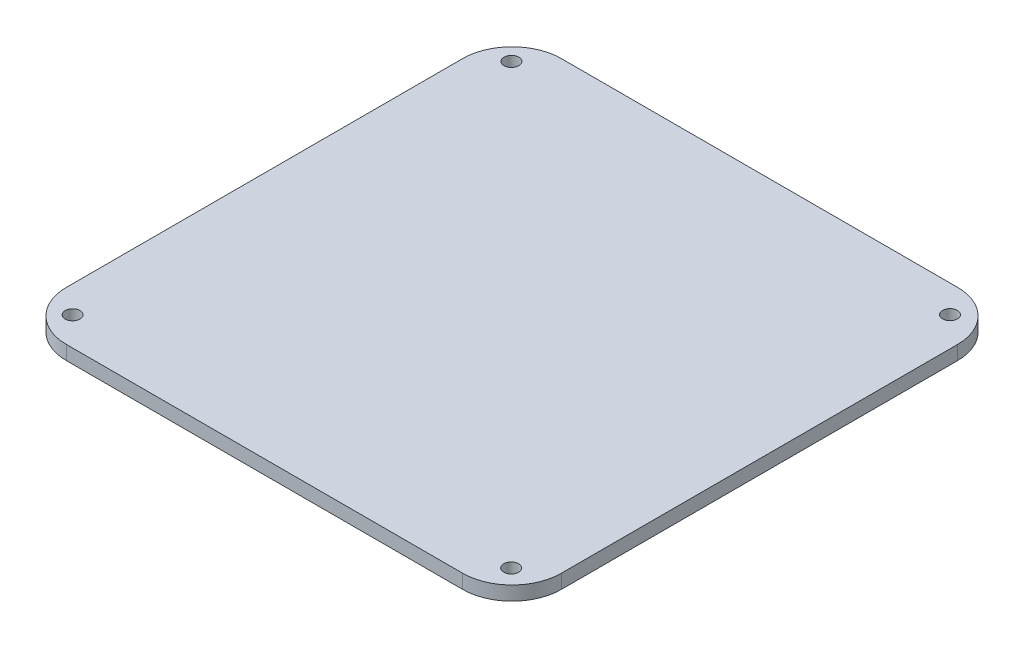
ISO-10303-21;
HEADER;
FILE_DESCRIPTION(('STEP AP214'),'2;1');
FILE_NAME('part.step','',(''),(''),'','','');
FILE_SCHEMA(('AUTOMOTIVE_DESIGN { 1 0 10303 214 1 1 1 1 }'));
ENDSEC;
DATA;
#1=APPLICATION_CONTEXT('core data for automotive mechanical design processes');
#2=APPLICATION_PROTOCOL_DEFINITION('international standard','automotive_design',2000,#1);
#3=PRODUCT_CONTEXT('',#1,'mechanical');
#4=PRODUCT('Part','Part','',(#3));
#5=PRODUCT_RELATED_PRODUCT_CATEGORY('part','',(#4));
#6=PRODUCT_DEFINITION_FORMATION('','',#4);
#7=PRODUCT_DEFINITION_CONTEXT('part definition',#1,'design');
#8=PRODUCT_DEFINITION('design','',#6,#7);
#9=PRODUCT_DEFINITION_SHAPE('','',#8);
#10=(LENGTH_UNIT() NAMED_UNIT(*) SI_UNIT(.MILLI.,.METRE.));
#11=(NAMED_UNIT(*) PLANE_ANGLE_UNIT() SI_UNIT($,.RADIAN.));
#12=(NAMED_UNIT(*) SI_UNIT($,.STERADIAN.) SOLID_ANGLE_UNIT());
#13=UNCERTAINTY_MEASURE_WITH_UNIT(LENGTH_MEASURE(1.E-05),#10,'distance_accuracy_value','');
#14=(GEOMETRIC_REPRESENTATION_CONTEXT(3) GLOBAL_UNCERTAINTY_ASSIGNED_CONTEXT((#13)) GLOBAL_UNIT_ASSIGNED_CONTEXT((#10,
#11,#12)) REPRESENTATION_CONTEXT('',''));
#15=CARTESIAN_POINT('',(0.,0.,0.));
#16=DIRECTION('',(0.,0.,1.));
#17=DIRECTION('',(1.,0.,0.));
#18=AXIS2_PLACEMENT_3D('',#15,#16,#17);
#19=CARTESIAN_POINT('',(81.3,2.56,-9.));
#20=DIRECTION('',(0.,-1.,0.));
#21=DIRECTION('',(0.,0.,-1.));
#22=AXIS2_PLACEMENT_3D('',#19,#20,#21);
#23=PLANE('',#22);
#24=CARTESIAN_POINT('',(81.3,2.56,-9.));
#25=DIRECTION('',(0.,1.,0.));
#26=DIRECTION('',(0.,0.,-1.));
#27=AXIS2_PLACEMENT_3D('',#24,#25,#26);
#28=CIRCLE('',#27,9.00000000000001);
#29=CARTESIAN_POINT('',(81.3,2.56,0.));
#30=VERTEX_POINT('',#29);
#31=CARTESIAN_POINT('',(90.3,2.56,-9.));
#32=VERTEX_POINT('',#31);
#33=EDGE_CURVE('E145',#30,#32,#28,.T.);
#34=ORIENTED_EDGE('',*,*,#33,.T.);
#35=DIRECTION('',(0.,0.,-1.));
#36=VECTOR('',#35,1.);
#37=CARTESIAN_POINT('',(90.3,2.56,-9.));
#38=LINE('',#37,#36);
#39=CARTESIAN_POINT('',(90.3,2.56,-81.3));
#40=VERTEX_POINT('',#39);
#41=EDGE_CURVE('E93',#32,#40,#38,.T.);
#42=ORIENTED_EDGE('',*,*,#41,.T.);
#43=CARTESIAN_POINT('',(81.3,2.56,-81.3));
#44=DIRECTION('',(0.,1.,0.));
#45=DIRECTION('',(0.,0.,-1.));
#46=AXIS2_PLACEMENT_3D('',#43,#44,#45);
#47=CIRCLE('',#46,8.99999999999999);
#48=CARTESIAN_POINT('',(81.3,2.56,-90.3));
#49=VERTEX_POINT('',#48);
#50=EDGE_CURVE('E160',#40,#49,#47,.T.);
#51=ORIENTED_EDGE('',*,*,#50,.T.);
#52=DIRECTION('',(-1.,0.,0.));
#53=VECTOR('',#52,1.);
#54=CARTESIAN_POINT('',(9.,2.56,-90.3));
#55=LINE('',#54,#53);
#56=CARTESIAN_POINT('',(9.,2.56,-90.3));
#57=VERTEX_POINT('',#56);
#58=EDGE_CURVE('E173',#49,#57,#55,.T.);
#59=ORIENTED_EDGE('',*,*,#58,.T.);
#60=CARTESIAN_POINT('',(9.,2.56,-81.3));
#61=DIRECTION('',(0.,1.,0.));
#62=DIRECTION('',(0.,0.,-1.));
#63=AXIS2_PLACEMENT_3D('',#60,#61,#62);
#64=CIRCLE('',#63,9.);
#65=CARTESIAN_POINT('',(0.,2.56,-81.3));
#66=VERTEX_POINT('',#65);
#67=EDGE_CURVE('E112',#57,#66,#64,.T.);
#68=ORIENTED_EDGE('',*,*,#67,.T.);
#69=DIRECTION('',(0.,0.,1.));
#70=VECTOR('',#69,1.);
#71=CARTESIAN_POINT('',(0.,2.56,-9.));
#72=LINE('',#71,#70);
#73=CARTESIAN_POINT('',(0.,2.56,-9.));
#74=VERTEX_POINT('',#73);
#75=EDGE_CURVE('E106',#66,#74,#72,.T.);
#76=ORIENTED_EDGE('',*,*,#75,.T.);
#77=CARTESIAN_POINT('',(9.,2.56,-9.));
#78=DIRECTION('',(0.,1.,0.));
#79=DIRECTION('',(0.,0.,-1.));
#80=AXIS2_PLACEMENT_3D('',#77,#78,#79);
#81=CIRCLE('',#80,9.);
#82=CARTESIAN_POINT('',(9.,2.56,0.));
#83=VERTEX_POINT('',#82);
#84=EDGE_CURVE('E110',#74,#83,#81,.T.);
#85=ORIENTED_EDGE('',*,*,#84,.T.);
#86=DIRECTION('',(1.,0.,0.));
#87=VECTOR('',#86,1.);
#88=CARTESIAN_POINT('',(9.,2.56,0.));
#89=LINE('',#88,#87);
#90=EDGE_CURVE('E50',#83,#30,#89,.T.);
#91=ORIENTED_EDGE('',*,*,#90,.T.);
#92=EDGE_LOOP('',(#34,#42,#51,#59,#68,#76,#85,#91));
#93=FACE_BOUND('',#92,.T.);
#94=CARTESIAN_POINT('',(4.9,2.56,-85.3));
#95=DIRECTION('',(0.,1.,0.));
#96=DIRECTION('',(0.,0.,1.));
#97=AXIS2_PLACEMENT_3D('',#94,#95,#96);
#98=CIRCLE('',#97,1.35);
#99=CARTESIAN_POINT('',(4.9,2.56,-86.65));
#100=VERTEX_POINT('',#99);
#101=EDGE_CURVE('E134',#100,#100,#98,.T.);
#102=ORIENTED_EDGE('',*,*,#101,.F.);
#103=EDGE_LOOP('',(#102));
#104=FACE_BOUND('',#103,.T.);
#105=CARTESIAN_POINT('',(84.9,2.56,-85.3));
#106=DIRECTION('',(0.,1.,0.));
#107=DIRECTION('',(0.,0.,1.));
#108=AXIS2_PLACEMENT_3D('',#105,#106,#107);
#109=CIRCLE('',#108,1.35000000000001);
#110=CARTESIAN_POINT('',(84.9,2.56,-86.65));
#111=VERTEX_POINT('',#110);
#112=EDGE_CURVE('E182',#111,#111,#109,.T.);
#113=ORIENTED_EDGE('',*,*,#112,.F.);
#114=EDGE_LOOP('',(#113));
#115=FACE_BOUND('',#114,.T.);
#116=CARTESIAN_POINT('',(84.9,2.56,-5.25));
#117=DIRECTION('',(0.,1.,0.));
#118=DIRECTION('',(0.,0.,1.));
#119=AXIS2_PLACEMENT_3D('',#116,#117,#118);
#120=CIRCLE('',#119,1.35000000000001);
#121=CARTESIAN_POINT('',(84.9,2.56,-6.60000000000001));
#122=VERTEX_POINT('',#121);
#123=EDGE_CURVE('E188',#122,#122,#120,.T.);
#124=ORIENTED_EDGE('',*,*,#123,.F.);
#125=EDGE_LOOP('',(#124));
#126=FACE_BOUND('',#125,.T.);
#127=CARTESIAN_POINT('',(4.9,2.56,-5.25));
#128=DIRECTION('',(0.,1.,0.));
#129=DIRECTION('',(0.,0.,1.));
#130=AXIS2_PLACEMENT_3D('',#127,#128,#129);
#131=CIRCLE('',#130,1.35);
#132=CARTESIAN_POINT('',(4.9,2.56,-6.6));
#133=VERTEX_POINT('',#132);
#134=EDGE_CURVE('E194',#133,#133,#131,.T.);
#135=ORIENTED_EDGE('',*,*,#134,.F.);
#136=EDGE_LOOP('',(#135));
#137=FACE_BOUND('',#136,.T.);
#138=ADVANCED_FACE('F33',(#93,#104,#115,#126,#137),#23,.F.);
#139=CARTESIAN_POINT('',(81.3,0.,-9.));
#140=DIRECTION('',(0.,-1.,0.));
#141=DIRECTION('',(0.,0.,-1.));
#142=AXIS2_PLACEMENT_3D('',#139,#140,#141);
#143=PLANE('',#142);
#144=CARTESIAN_POINT('',(84.9,0.,-5.25));
#145=DIRECTION('',(0.,1.,0.));
#146=DIRECTION('',(0.,0.,1.));
#147=AXIS2_PLACEMENT_3D('',#144,#145,#146);
#148=CIRCLE('',#147,1.35000000000001);
#149=CARTESIAN_POINT('',(84.9,0.,-6.60000000000001));
#150=VERTEX_POINT('',#149);
#151=EDGE_CURVE('E191',#150,#150,#148,.T.);
#152=ORIENTED_EDGE('',*,*,#151,.T.);
#153=EDGE_LOOP('',(#152));
#154=FACE_BOUND('',#153,.T.);
#155=CARTESIAN_POINT('',(4.9,0.,-85.3));
#156=DIRECTION('',(0.,1.,0.));
#157=DIRECTION('',(0.,0.,1.));
#158=AXIS2_PLACEMENT_3D('',#155,#156,#157);
#159=CIRCLE('',#158,1.35);
#160=CARTESIAN_POINT('',(4.9,0.,-86.65));
#161=VERTEX_POINT('',#160);
#162=EDGE_CURVE('E179',#161,#161,#159,.T.);
#163=ORIENTED_EDGE('',*,*,#162,.T.);
#164=EDGE_LOOP('',(#163));
#165=FACE_BOUND('',#164,.T.);
#166=CARTESIAN_POINT('',(81.3,0.,-9.));
#167=DIRECTION('',(0.,1.,0.));
#168=DIRECTION('',(0.,0.,-1.));
#169=AXIS2_PLACEMENT_3D('',#166,#167,#168);
#170=CIRCLE('',#169,9.00000000000001);
#171=CARTESIAN_POINT('',(81.3,0.,0.));
#172=VERTEX_POINT('',#171);
#173=CARTESIAN_POINT('',(90.3,0.,-9.));
#174=VERTEX_POINT('',#173);
#175=EDGE_CURVE('E130',#172,#174,#170,.T.);
#176=ORIENTED_EDGE('',*,*,#175,.F.);
#177=DIRECTION('',(1.,0.,0.));
#178=VECTOR('',#177,1.);
#179=CARTESIAN_POINT('',(9.,0.,0.));
#180=LINE('',#179,#178);
#181=CARTESIAN_POINT('',(9.,0.,0.));
#182=VERTEX_POINT('',#181);
#183=EDGE_CURVE('E85',#182,#172,#180,.T.);
#184=ORIENTED_EDGE('',*,*,#183,.F.);
#185=CARTESIAN_POINT('',(9.,0.,-9.));
#186=DIRECTION('',(0.,1.,0.));
#187=DIRECTION('',(0.,0.,-1.));
#188=AXIS2_PLACEMENT_3D('',#185,#186,#187);
#189=CIRCLE('',#188,9.);
#190=CARTESIAN_POINT('',(0.,0.,-9.));
#191=VERTEX_POINT('',#190);
#192=EDGE_CURVE('E79',#191,#182,#189,.T.);
#193=ORIENTED_EDGE('',*,*,#192,.F.);
#194=DIRECTION('',(0.,0.,1.));
#195=VECTOR('',#194,1.);
#196=CARTESIAN_POINT('',(0.,0.,-9.));
#197=LINE('',#196,#195);
#198=CARTESIAN_POINT('',(0.,0.,-81.3));
#199=VERTEX_POINT('',#198);
#200=EDGE_CURVE('E120',#199,#191,#197,.T.);
#201=ORIENTED_EDGE('',*,*,#200,.F.);
#202=CARTESIAN_POINT('',(9.,0.,-81.3));
#203=DIRECTION('',(0.,1.,0.));
#204=DIRECTION('',(0.,0.,-1.));
#205=AXIS2_PLACEMENT_3D('',#202,#203,#204);
#206=CIRCLE('',#205,9.);
#207=CARTESIAN_POINT('',(9.,0.,-90.3));
#208=VERTEX_POINT('',#207);
#209=EDGE_CURVE('E140',#208,#199,#206,.T.);
#210=ORIENTED_EDGE('',*,*,#209,.F.);
#211=DIRECTION('',(-1.,0.,0.));
#212=VECTOR('',#211,1.);
#213=CARTESIAN_POINT('',(9.,0.,-90.3));
#214=LINE('',#213,#212);
#215=CARTESIAN_POINT('',(81.3,0.,-90.3));
#216=VERTEX_POINT('',#215);
#217=EDGE_CURVE('E138',#216,#208,#214,.T.);
#218=ORIENTED_EDGE('',*,*,#217,.F.);
#219=CARTESIAN_POINT('',(81.3,0.,-81.3));
#220=DIRECTION('',(0.,1.,0.));
#221=DIRECTION('',(0.,0.,-1.));
#222=AXIS2_PLACEMENT_3D('',#219,#220,#221);
#223=CIRCLE('',#222,8.99999999999999);
#224=CARTESIAN_POINT('',(90.3,0.,-81.3));
#225=VERTEX_POINT('',#224);
#226=EDGE_CURVE('E136',#225,#216,#223,.T.);
#227=ORIENTED_EDGE('',*,*,#226,.F.);
#228=DIRECTION('',(0.,0.,-1.));
#229=VECTOR('',#228,1.);
#230=CARTESIAN_POINT('',(90.3,0.,-9.));
#231=LINE('',#230,#229);
#232=EDGE_CURVE('E133',#174,#225,#231,.T.);
#233=ORIENTED_EDGE('',*,*,#232,.F.);
#234=EDGE_LOOP('',(#176,#184,#193,#201,#210,#218,#227,#233));
#235=FACE_BOUND('',#234,.T.);
#236=CARTESIAN_POINT('',(84.9,0.,-85.3));
#237=DIRECTION('',(0.,1.,0.));
#238=DIRECTION('',(0.,0.,1.));
#239=AXIS2_PLACEMENT_3D('',#236,#237,#238);
#240=CIRCLE('',#239,1.35000000000001);
#241=CARTESIAN_POINT('',(84.9,0.,-86.65));
#242=VERTEX_POINT('',#241);
#243=EDGE_CURVE('E185',#242,#242,#240,.T.);
#244=ORIENTED_EDGE('',*,*,#243,.T.);
#245=EDGE_LOOP('',(#244));
#246=FACE_BOUND('',#245,.T.);
#247=CARTESIAN_POINT('',(4.9,0.,-5.25));
#248=DIRECTION('',(0.,1.,0.));
#249=DIRECTION('',(0.,0.,1.));
#250=AXIS2_PLACEMENT_3D('',#247,#248,#249);
#251=CIRCLE('',#250,1.35);
#252=CARTESIAN_POINT('',(4.9,0.,-6.6));
#253=VERTEX_POINT('',#252);
#254=EDGE_CURVE('E197',#253,#253,#251,.T.);
#255=ORIENTED_EDGE('',*,*,#254,.T.);
#256=EDGE_LOOP('',(#255));
#257=FACE_BOUND('',#256,.T.);
#258=ADVANCED_FACE('F164',(#154,#165,#235,#246,#257),#143,.T.);
#259=CARTESIAN_POINT('',(81.3,2.56,-9.));
#260=DIRECTION('',(0.,-1.,0.));
#261=DIRECTION('',(0.,0.,-1.));
#262=AXIS2_PLACEMENT_3D('',#259,#260,#261);
#263=CYLINDRICAL_SURFACE('',#262,9.00000000000001);
#264=ORIENTED_EDGE('',*,*,#175,.T.);
#265=DIRECTION('',(0.,-1.,0.));
#266=VECTOR('',#265,1.);
#267=CARTESIAN_POINT('',(90.3,2.56,-9.));
#268=LINE('',#267,#266);
#269=EDGE_CURVE('E11',#32,#174,#268,.T.);
#270=ORIENTED_EDGE('',*,*,#269,.F.);
#271=ORIENTED_EDGE('',*,*,#33,.F.);
#272=DIRECTION('',(0.,-1.,0.));
#273=VECTOR('',#272,1.);
#274=CARTESIAN_POINT('',(81.3,2.56,0.));
#275=LINE('',#274,#273);
#276=EDGE_CURVE('E126',#30,#172,#275,.T.);
#277=ORIENTED_EDGE('',*,*,#276,.T.);
#278=EDGE_LOOP('',(#264,#270,#271,#277));
#279=FACE_BOUND('',#278,.T.);
#280=ADVANCED_FACE('F35',(#279),#263,.T.);
#281=CARTESIAN_POINT('',(90.3,2.56,-9.));
#282=DIRECTION('',(-1.,0.,0.));
#283=DIRECTION('',(0.,0.,1.));
#284=AXIS2_PLACEMENT_3D('',#281,#282,#283);
#285=PLANE('',#284);
#286=ORIENTED_EDGE('',*,*,#232,.T.);
#287=DIRECTION('',(0.,-1.,0.));
#288=VECTOR('',#287,1.);
#289=CARTESIAN_POINT('',(90.3,2.56,-81.3));
#290=LINE('',#289,#288);
#291=EDGE_CURVE('E42',#40,#225,#290,.T.);
#292=ORIENTED_EDGE('',*,*,#291,.F.);
#293=ORIENTED_EDGE('',*,*,#41,.F.);
#294=ORIENTED_EDGE('',*,*,#269,.T.);
#295=EDGE_LOOP('',(#286,#292,#293,#294));
#296=FACE_BOUND('',#295,.T.);
#297=ADVANCED_FACE('F229',(#296),#285,.F.);
#298=CARTESIAN_POINT('',(81.3,2.56,-81.3));
#299=DIRECTION('',(0.,-1.,0.));
#300=DIRECTION('',(0.,0.,-1.));
#301=AXIS2_PLACEMENT_3D('',#298,#299,#300);
#302=CYLINDRICAL_SURFACE('',#301,8.99999999999999);
#303=ORIENTED_EDGE('',*,*,#226,.T.);
#304=DIRECTION('',(0.,-1.,0.));
#305=VECTOR('',#304,1.);
#306=CARTESIAN_POINT('',(81.3,2.56,-90.3));
#307=LINE('',#306,#305);
#308=EDGE_CURVE('E152',#49,#216,#307,.T.);
#309=ORIENTED_EDGE('',*,*,#308,.F.);
#310=ORIENTED_EDGE('',*,*,#50,.F.);
#311=ORIENTED_EDGE('',*,*,#291,.T.);
#312=EDGE_LOOP('',(#303,#309,#310,#311));
#313=FACE_BOUND('',#312,.T.);
#314=ADVANCED_FACE('F158',(#313),#302,.T.);
#315=CARTESIAN_POINT('',(9.,2.56,-90.3));
#316=DIRECTION('',(0.,0.,1.));
#317=DIRECTION('',(1.,0.,0.));
#318=AXIS2_PLACEMENT_3D('',#315,#316,#317);
#319=PLANE('',#318);
#320=ORIENTED_EDGE('',*,*,#217,.T.);
#321=DIRECTION('',(0.,-1.,0.));
#322=VECTOR('',#321,1.);
#323=CARTESIAN_POINT('',(9.,2.56,-90.3));
#324=LINE('',#323,#322);
#325=EDGE_CURVE('E149',#57,#208,#324,.T.);
#326=ORIENTED_EDGE('',*,*,#325,.F.);
#327=ORIENTED_EDGE('',*,*,#58,.F.);
#328=ORIENTED_EDGE('',*,*,#308,.T.);
#329=EDGE_LOOP('',(#320,#326,#327,#328));
#330=FACE_BOUND('',#329,.T.);
#331=ADVANCED_FACE('F169',(#330),#319,.F.);
#332=CARTESIAN_POINT('',(9.,2.56,-81.3));
#333=DIRECTION('',(0.,-1.,0.));
#334=DIRECTION('',(0.,0.,-1.));
#335=AXIS2_PLACEMENT_3D('',#332,#333,#334);
#336=CYLINDRICAL_SURFACE('',#335,9.);
#337=ORIENTED_EDGE('',*,*,#209,.T.);
#338=DIRECTION('',(0.,-1.,0.));
#339=VECTOR('',#338,1.);
#340=CARTESIAN_POINT('',(0.,2.56,-81.3));
#341=LINE('',#340,#339);
#342=EDGE_CURVE('E121',#66,#199,#341,.T.);
#343=ORIENTED_EDGE('',*,*,#342,.F.);
#344=ORIENTED_EDGE('',*,*,#67,.F.);
#345=ORIENTED_EDGE('',*,*,#325,.T.);
#346=EDGE_LOOP('',(#337,#343,#344,#345));
#347=FACE_BOUND('',#346,.T.);
#348=ADVANCED_FACE('F172',(#347),#336,.T.);
#349=CARTESIAN_POINT('',(0.,2.56,-9.));
#350=DIRECTION('',(1.,0.,0.));
#351=DIRECTION('',(0.,0.,-1.));
#352=AXIS2_PLACEMENT_3D('',#349,#350,#351);
#353=PLANE('',#352);
#354=ORIENTED_EDGE('',*,*,#200,.T.);
#355=DIRECTION('',(0.,-1.,0.));
#356=VECTOR('',#355,1.);
#357=CARTESIAN_POINT('',(0.,2.56,-9.));
#358=LINE('',#357,#356);
#359=EDGE_CURVE('E117',#74,#191,#358,.T.);
#360=ORIENTED_EDGE('',*,*,#359,.F.);
#361=ORIENTED_EDGE('',*,*,#75,.F.);
#362=ORIENTED_EDGE('',*,*,#342,.T.);
#363=EDGE_LOOP('',(#354,#360,#361,#362));
#364=FACE_BOUND('',#363,.T.);
#365=ADVANCED_FACE('F118',(#364),#353,.F.);
#366=CARTESIAN_POINT('',(9.,2.56,-9.));
#367=DIRECTION('',(0.,-1.,0.));
#368=DIRECTION('',(0.,0.,-1.));
#369=AXIS2_PLACEMENT_3D('',#366,#367,#368);
#370=CYLINDRICAL_SURFACE('',#369,9.);
#371=ORIENTED_EDGE('',*,*,#192,.T.);
#372=DIRECTION('',(0.,-1.,0.));
#373=VECTOR('',#372,1.);
#374=CARTESIAN_POINT('',(9.,2.56,0.));
#375=LINE('',#374,#373);
#376=EDGE_CURVE('E122',#83,#182,#375,.T.);
#377=ORIENTED_EDGE('',*,*,#376,.F.);
#378=ORIENTED_EDGE('',*,*,#84,.F.);
#379=ORIENTED_EDGE('',*,*,#359,.T.);
#380=EDGE_LOOP('',(#371,#377,#378,#379));
#381=FACE_BOUND('',#380,.T.);
#382=ADVANCED_FACE('F124',(#381),#370,.T.);
#383=CARTESIAN_POINT('',(9.,2.56,0.));
#384=DIRECTION('',(0.,0.,-1.));
#385=DIRECTION('',(-1.,0.,0.));
#386=AXIS2_PLACEMENT_3D('',#383,#384,#385);
#387=PLANE('',#386);
#388=ORIENTED_EDGE('',*,*,#183,.T.);
#389=ORIENTED_EDGE('',*,*,#276,.F.);
#390=ORIENTED_EDGE('',*,*,#90,.F.);
#391=ORIENTED_EDGE('',*,*,#376,.T.);
#392=EDGE_LOOP('',(#388,#389,#390,#391));
#393=FACE_BOUND('',#392,.T.);
#394=ADVANCED_FACE('F217',(#393),#387,.F.);
#395=CARTESIAN_POINT('',(4.9,2.56,-85.3));
#396=DIRECTION('',(0.,-1.,0.));
#397=DIRECTION('',(0.,0.,-1.));
#398=AXIS2_PLACEMENT_3D('',#395,#396,#397);
#399=CYLINDRICAL_SURFACE('',#398,1.35);
#400=CARTESIAN_POINT('',(4.9,2.56,-86.65));
#401=CARTESIAN_POINT('',(4.9,2.53333333333333,-86.65));
#402=CARTESIAN_POINT('',(4.9,2.50666666666667,-86.65));
#403=CARTESIAN_POINT('',(4.9,2.45333333333333,-86.65));
#404=CARTESIAN_POINT('',(4.9,2.42666666666667,-86.65));
#405=CARTESIAN_POINT('',(4.9,2.37333333333333,-86.65));
#406=CARTESIAN_POINT('',(4.9,2.34666666666667,-86.65));
#407=CARTESIAN_POINT('',(4.9,2.29333333333333,-86.65));
#408=CARTESIAN_POINT('',(4.9,2.26666666666667,-86.65));
#409=CARTESIAN_POINT('',(4.9,2.21333333333333,-86.65));
#410=CARTESIAN_POINT('',(4.9,2.18666666666667,-86.65));
#411=CARTESIAN_POINT('',(4.9,2.13333333333333,-86.65));
#412=CARTESIAN_POINT('',(4.9,2.10666666666667,-86.65));
#413=CARTESIAN_POINT('',(4.9,2.05333333333333,-86.65));
#414=CARTESIAN_POINT('',(4.9,2.02666666666667,-86.65));
#415=CARTESIAN_POINT('',(4.9,1.97333333333333,-86.65));
#416=CARTESIAN_POINT('',(4.9,1.94666666666667,-86.65));
#417=CARTESIAN_POINT('',(4.9,1.89333333333333,-86.65));
#418=CARTESIAN_POINT('',(4.9,1.86666666666667,-86.65));
#419=CARTESIAN_POINT('',(4.9,1.81333333333333,-86.65));
#420=CARTESIAN_POINT('',(4.9,1.78666666666667,-86.65));
#421=CARTESIAN_POINT('',(4.9,1.73333333333333,-86.65));
#422=CARTESIAN_POINT('',(4.9,1.70666666666667,-86.65));
#423=CARTESIAN_POINT('',(4.9,1.65333333333333,-86.65));
#424=CARTESIAN_POINT('',(4.9,1.62666666666667,-86.65));
#425=CARTESIAN_POINT('',(4.9,1.57333333333333,-86.65));
#426=CARTESIAN_POINT('',(4.9,1.54666666666667,-86.65));
#427=CARTESIAN_POINT('',(4.9,1.49333333333333,-86.65));
#428=CARTESIAN_POINT('',(4.9,1.46666666666667,-86.65));
#429=CARTESIAN_POINT('',(4.9,1.41333333333333,-86.65));
#430=CARTESIAN_POINT('',(4.9,1.38666666666667,-86.65));
#431=CARTESIAN_POINT('',(4.9,1.33333333333333,-86.65));
#432=CARTESIAN_POINT('',(4.9,1.30666666666667,-86.65));
#433=CARTESIAN_POINT('',(4.9,1.25333333333333,-86.65));
#434=CARTESIAN_POINT('',(4.9,1.22666666666667,-86.65));
#435=CARTESIAN_POINT('',(4.9,1.17333333333333,-86.65));
#436=CARTESIAN_POINT('',(4.9,1.14666666666667,-86.65));
#437=CARTESIAN_POINT('',(4.9,1.09333333333333,-86.65));
#438=CARTESIAN_POINT('',(4.9,1.06666666666667,-86.65));
#439=CARTESIAN_POINT('',(4.9,1.01333333333333,-86.65));
#440=CARTESIAN_POINT('',(4.9,0.986666666666666,-86.65));
#441=CARTESIAN_POINT('',(4.9,0.933333333333333,-86.65));
#442=CARTESIAN_POINT('',(4.9,0.906666666666666,-86.65));
#443=CARTESIAN_POINT('',(4.9,0.853333333333333,-86.65));
#444=CARTESIAN_POINT('',(4.9,0.826666666666666,-86.65));
#445=CARTESIAN_POINT('',(4.9,0.773333333333333,-86.65));
#446=CARTESIAN_POINT('',(4.9,0.746666666666666,-86.65));
#447=CARTESIAN_POINT('',(4.9,0.693333333333333,-86.65));
#448=CARTESIAN_POINT('',(4.9,0.666666666666666,-86.65));
#449=CARTESIAN_POINT('',(4.9,0.613333333333333,-86.65));
#450=CARTESIAN_POINT('',(4.9,0.586666666666667,-86.65));
#451=CARTESIAN_POINT('',(4.9,0.533333333333333,-86.65));
#452=CARTESIAN_POINT('',(4.9,0.506666666666667,-86.65));
#453=CARTESIAN_POINT('',(4.9,0.453333333333333,-86.65));
#454=CARTESIAN_POINT('',(4.9,0.426666666666667,-86.65));
#455=CARTESIAN_POINT('',(4.9,0.373333333333333,-86.65));
#456=CARTESIAN_POINT('',(4.9,0.346666666666667,-86.65));
#457=CARTESIAN_POINT('',(4.9,0.293333333333333,-86.65));
#458=CARTESIAN_POINT('',(4.9,0.266666666666667,-86.65));
#459=CARTESIAN_POINT('',(4.9,0.213333333333333,-86.65));
#460=CARTESIAN_POINT('',(4.9,0.186666666666667,-86.65));
#461=CARTESIAN_POINT('',(4.9,0.133333333333333,-86.65));
#462=CARTESIAN_POINT('',(4.9,0.106666666666667,-86.65));
#463=CARTESIAN_POINT('',(4.9,0.0533333333333335,-86.65));
#464=CARTESIAN_POINT('',(4.9,0.0266666666666667,-86.65));
#465=CARTESIAN_POINT('',(4.9,0.,-86.65));
#466=B_SPLINE_CURVE_WITH_KNOTS('',3,(#400,#401,#402,#403,#404,#405,#406,#407,#408,#409,#410,
#411,#412,#413,#414,#415,#416,#417,#418,#419,#420,#421,#422,#423,#424,#425,#426,#427,#428,#429,
#430,#431,#432,#433,#434,#435,#436,#437,#438,#439,#440,#441,#442,#443,#444,#445,#446,#447,#448,
#449,#450,#451,#452,#453,#454,#455,#456,#457,#458,#459,#460,#461,#462,#463,#464,#465),
.UNSPECIFIED.,.F.,.F.,(4,2,2,2,2,2,2,2,2,2,2,2,2,2,2,2,2,2,2,2,2,2,2,2,2,2,2,2,2,2,2,2,4),(0.,
0.0800000000000002,0.16,0.24,0.32,0.4,0.48,0.56,0.64,0.72,0.8,0.88,0.96,1.04,1.12,1.2,1.28,1.36,
1.44,1.52,1.6,1.68,1.76,1.84,1.92,2.,2.08,2.16,2.24,2.32,2.4,2.48,2.56),.UNSPECIFIED.);
#467=EDGE_CURVE('BSEAM214',#100,#161,#466,.T.);
#468=ORIENTED_EDGE('',*,*,#101,.T.);
#469=ORIENTED_EDGE('',*,*,#162,.F.);
#470=ORIENTED_EDGE('',*,*,#467,.T.);
#471=ORIENTED_EDGE('',*,*,#467,.F.);
#472=EDGE_LOOP('',(#468,#470,#469,#471));
#473=FACE_BOUND('',#472,.T.);
#474=ADVANCED_FACE('F214',(#473),#399,.F.);
#475=CARTESIAN_POINT('',(84.9,2.56,-85.3));
#476=DIRECTION('',(0.,-1.,0.));
#477=DIRECTION('',(0.,0.,-1.));
#478=AXIS2_PLACEMENT_3D('',#475,#476,#477);
#479=CYLINDRICAL_SURFACE('',#478,1.35000000000001);
#480=CARTESIAN_POINT('',(84.9,2.56,-86.65));
#481=CARTESIAN_POINT('',(84.9,2.53333333333333,-86.65));
#482=CARTESIAN_POINT('',(84.9,2.50666666666667,-86.65));
#483=CARTESIAN_POINT('',(84.9,2.45333333333333,-86.65));
#484=CARTESIAN_POINT('',(84.9,2.42666666666667,-86.65));
#485=CARTESIAN_POINT('',(84.9,2.37333333333333,-86.65));
#486=CARTESIAN_POINT('',(84.9,2.34666666666667,-86.65));
#487=CARTESIAN_POINT('',(84.9,2.29333333333333,-86.65));
#488=CARTESIAN_POINT('',(84.9,2.26666666666667,-86.65));
#489=CARTESIAN_POINT('',(84.9,2.21333333333333,-86.65));
#490=CARTESIAN_POINT('',(84.9,2.18666666666667,-86.65));
#491=CARTESIAN_POINT('',(84.9,2.13333333333333,-86.65));
#492=CARTESIAN_POINT('',(84.9,2.10666666666667,-86.65));
#493=CARTESIAN_POINT('',(84.9,2.05333333333333,-86.65));
#494=CARTESIAN_POINT('',(84.9,2.02666666666667,-86.65));
#495=CARTESIAN_POINT('',(84.9,1.97333333333333,-86.65));
#496=CARTESIAN_POINT('',(84.9,1.94666666666667,-86.65));
#497=CARTESIAN_POINT('',(84.9,1.89333333333333,-86.65));
#498=CARTESIAN_POINT('',(84.9,1.86666666666667,-86.65));
#499=CARTESIAN_POINT('',(84.9,1.81333333333333,-86.65));
#500=CARTESIAN_POINT('',(84.9,1.78666666666667,-86.65));
#501=CARTESIAN_POINT('',(84.9,1.73333333333333,-86.65));
#502=CARTESIAN_POINT('',(84.9,1.70666666666667,-86.65));
#503=CARTESIAN_POINT('',(84.9,1.65333333333333,-86.65));
#504=CARTESIAN_POINT('',(84.9,1.62666666666667,-86.65));
#505=CARTESIAN_POINT('',(84.9,1.57333333333333,-86.65));
#506=CARTESIAN_POINT('',(84.9,1.54666666666667,-86.65));
#507=CARTESIAN_POINT('',(84.9,1.49333333333333,-86.65));
#508=CARTESIAN_POINT('',(84.9,1.46666666666667,-86.65));
#509=CARTESIAN_POINT('',(84.9,1.41333333333333,-86.65));
#510=CARTESIAN_POINT('',(84.9,1.38666666666667,-86.65));
#511=CARTESIAN_POINT('',(84.9,1.33333333333333,-86.65));
#512=CARTESIAN_POINT('',(84.9,1.30666666666667,-86.65));
#513=CARTESIAN_POINT('',(84.9,1.25333333333333,-86.65));
#514=CARTESIAN_POINT('',(84.9,1.22666666666667,-86.65));
#515=CARTESIAN_POINT('',(84.9,1.17333333333333,-86.65));
#516=CARTESIAN_POINT('',(84.9,1.14666666666667,-86.65));
#517=CARTESIAN_POINT('',(84.9,1.09333333333333,-86.65));
#518=CARTESIAN_POINT('',(84.9,1.06666666666667,-86.65));
#519=CARTESIAN_POINT('',(84.9,1.01333333333333,-86.65));
#520=CARTESIAN_POINT('',(84.9,0.986666666666666,-86.65));
#521=CARTESIAN_POINT('',(84.9,0.933333333333333,-86.65));
#522=CARTESIAN_POINT('',(84.9,0.906666666666666,-86.65));
#523=CARTESIAN_POINT('',(84.9,0.853333333333333,-86.65));
#524=CARTESIAN_POINT('',(84.9,0.826666666666666,-86.65));
#525=CARTESIAN_POINT('',(84.9,0.773333333333333,-86.65));
#526=CARTESIAN_POINT('',(84.9,0.746666666666666,-86.65));
#527=CARTESIAN_POINT('',(84.9,0.693333333333333,-86.65));
#528=CARTESIAN_POINT('',(84.9,0.666666666666666,-86.65));
#529=CARTESIAN_POINT('',(84.9,0.613333333333333,-86.65));
#530=CARTESIAN_POINT('',(84.9,0.586666666666667,-86.65));
#531=CARTESIAN_POINT('',(84.9,0.533333333333333,-86.65));
#532=CARTESIAN_POINT('',(84.9,0.506666666666667,-86.65));
#533=CARTESIAN_POINT('',(84.9,0.453333333333333,-86.65));
#534=CARTESIAN_POINT('',(84.9,0.426666666666667,-86.65));
#535=CARTESIAN_POINT('',(84.9,0.373333333333333,-86.65));
#536=CARTESIAN_POINT('',(84.9,0.346666666666667,-86.65));
#537=CARTESIAN_POINT('',(84.9,0.293333333333333,-86.65));
#538=CARTESIAN_POINT('',(84.9,0.266666666666667,-86.65));
#539=CARTESIAN_POINT('',(84.9,0.213333333333333,-86.65));
#540=CARTESIAN_POINT('',(84.9,0.186666666666667,-86.65));
#541=CARTESIAN_POINT('',(84.9,0.133333333333333,-86.65));
#542=CARTESIAN_POINT('',(84.9,0.106666666666667,-86.65));
#543=CARTESIAN_POINT('',(84.9,0.0533333333333335,-86.65));
#544=CARTESIAN_POINT('',(84.9,0.0266666666666667,-86.65));
#545=CARTESIAN_POINT('',(84.9,0.,-86.65));
#546=B_SPLINE_CURVE_WITH_KNOTS('',3,(#480,#481,#482,#483,#484,#485,#486,#487,#488,#489,#490,
#491,#492,#493,#494,#495,#496,#497,#498,#499,#500,#501,#502,#503,#504,#505,#506,#507,#508,#509,
#510,#511,#512,#513,#514,#515,#516,#517,#518,#519,#520,#521,#522,#523,#524,#525,#526,#527,#528,
#529,#530,#531,#532,#533,#534,#535,#536,#537,#538,#539,#540,#541,#542,#543,#544,#545),
.UNSPECIFIED.,.F.,.F.,(4,2,2,2,2,2,2,2,2,2,2,2,2,2,2,2,2,2,2,2,2,2,2,2,2,2,2,2,2,2,2,2,4),(0.,
0.0800000000000002,0.16,0.24,0.32,0.4,0.48,0.56,0.64,0.72,0.8,0.88,0.96,1.04,1.12,1.2,1.28,1.36,
1.44,1.52,1.6,1.68,1.76,1.84,1.92,2.,2.08,2.16,2.24,2.32,2.4,2.48,2.56),.UNSPECIFIED.);
#547=EDGE_CURVE('BSEAM293',#111,#242,#546,.T.);
#548=ORIENTED_EDGE('',*,*,#112,.T.);
#549=ORIENTED_EDGE('',*,*,#243,.F.);
#550=ORIENTED_EDGE('',*,*,#547,.T.);
#551=ORIENTED_EDGE('',*,*,#547,.F.);
#552=EDGE_LOOP('',(#548,#550,#549,#551));
#553=FACE_BOUND('',#552,.T.);
#554=ADVANCED_FACE('F293',(#553),#479,.F.);
#555=CARTESIAN_POINT('',(84.9,2.56,-5.25));
#556=DIRECTION('',(0.,-1.,0.));
#557=DIRECTION('',(0.,0.,-1.));
#558=AXIS2_PLACEMENT_3D('',#555,#556,#557);
#559=CYLINDRICAL_SURFACE('',#558,1.35000000000001);
#560=CARTESIAN_POINT('',(84.9,2.56,-6.60000000000001));
#561=CARTESIAN_POINT('',(84.9,2.53333333333333,-6.60000000000001));
#562=CARTESIAN_POINT('',(84.9,2.50666666666667,-6.60000000000001));
#563=CARTESIAN_POINT('',(84.9,2.45333333333333,-6.60000000000001));
#564=CARTESIAN_POINT('',(84.9,2.42666666666667,-6.60000000000001));
#565=CARTESIAN_POINT('',(84.9,2.37333333333333,-6.60000000000001));
#566=CARTESIAN_POINT('',(84.9,2.34666666666667,-6.60000000000001));
#567=CARTESIAN_POINT('',(84.9,2.29333333333333,-6.60000000000001));
#568=CARTESIAN_POINT('',(84.9,2.26666666666667,-6.60000000000001));
#569=CARTESIAN_POINT('',(84.9,2.21333333333333,-6.60000000000001));
#570=CARTESIAN_POINT('',(84.9,2.18666666666667,-6.60000000000001));
#571=CARTESIAN_POINT('',(84.9,2.13333333333333,-6.60000000000001));
#572=CARTESIAN_POINT('',(84.9,2.10666666666667,-6.60000000000001));
#573=CARTESIAN_POINT('',(84.9,2.05333333333333,-6.60000000000001));
#574=CARTESIAN_POINT('',(84.9,2.02666666666667,-6.60000000000001));
#575=CARTESIAN_POINT('',(84.9,1.97333333333333,-6.60000000000001));
#576=CARTESIAN_POINT('',(84.9,1.94666666666667,-6.60000000000001));
#577=CARTESIAN_POINT('',(84.9,1.89333333333333,-6.60000000000001));
#578=CARTESIAN_POINT('',(84.9,1.86666666666667,-6.60000000000001));
#579=CARTESIAN_POINT('',(84.9,1.81333333333333,-6.60000000000001));
#580=CARTESIAN_POINT('',(84.9,1.78666666666667,-6.60000000000001));
#581=CARTESIAN_POINT('',(84.9,1.73333333333333,-6.60000000000001));
#582=CARTESIAN_POINT('',(84.9,1.70666666666667,-6.60000000000001));
#583=CARTESIAN_POINT('',(84.9,1.65333333333333,-6.60000000000001));
#584=CARTESIAN_POINT('',(84.9,1.62666666666667,-6.60000000000001));
#585=CARTESIAN_POINT('',(84.9,1.57333333333333,-6.60000000000001));
#586=CARTESIAN_POINT('',(84.9,1.54666666666667,-6.60000000000001));
#587=CARTESIAN_POINT('',(84.9,1.49333333333333,-6.60000000000001));
#588=CARTESIAN_POINT('',(84.9,1.46666666666667,-6.60000000000001));
#589=CARTESIAN_POINT('',(84.9,1.41333333333333,-6.60000000000001));
#590=CARTESIAN_POINT('',(84.9,1.38666666666667,-6.60000000000001));
#591=CARTESIAN_POINT('',(84.9,1.33333333333333,-6.60000000000001));
#592=CARTESIAN_POINT('',(84.9,1.30666666666667,-6.60000000000001));
#593=CARTESIAN_POINT('',(84.9,1.25333333333333,-6.60000000000001));
#594=CARTESIAN_POINT('',(84.9,1.22666666666667,-6.60000000000001));
#595=CARTESIAN_POINT('',(84.9,1.17333333333333,-6.60000000000001));
#596=CARTESIAN_POINT('',(84.9,1.14666666666667,-6.60000000000001));
#597=CARTESIAN_POINT('',(84.9,1.09333333333333,-6.60000000000001));
#598=CARTESIAN_POINT('',(84.9,1.06666666666667,-6.60000000000001));
#599=CARTESIAN_POINT('',(84.9,1.01333333333333,-6.60000000000001));
#600=CARTESIAN_POINT('',(84.9,0.986666666666666,-6.60000000000001));
#601=CARTESIAN_POINT('',(84.9,0.933333333333333,-6.60000000000001));
#602=CARTESIAN_POINT('',(84.9,0.906666666666666,-6.60000000000001));
#603=CARTESIAN_POINT('',(84.9,0.853333333333333,-6.60000000000001));
#604=CARTESIAN_POINT('',(84.9,0.826666666666666,-6.60000000000001));
#605=CARTESIAN_POINT('',(84.9,0.773333333333333,-6.60000000000001));
#606=CARTESIAN_POINT('',(84.9,0.746666666666666,-6.60000000000001));
#607=CARTESIAN_POINT('',(84.9,0.693333333333333,-6.60000000000001));
#608=CARTESIAN_POINT('',(84.9,0.666666666666666,-6.60000000000001));
#609=CARTESIAN_POINT('',(84.9,0.613333333333333,-6.60000000000001));
#610=CARTESIAN_POINT('',(84.9,0.586666666666667,-6.60000000000001));
#611=CARTESIAN_POINT('',(84.9,0.533333333333333,-6.60000000000001));
#612=CARTESIAN_POINT('',(84.9,0.506666666666667,-6.60000000000001));
#613=CARTESIAN_POINT('',(84.9,0.453333333333333,-6.60000000000001));
#614=CARTESIAN_POINT('',(84.9,0.426666666666667,-6.60000000000001));
#615=CARTESIAN_POINT('',(84.9,0.373333333333333,-6.60000000000001));
#616=CARTESIAN_POINT('',(84.9,0.346666666666667,-6.60000000000001));
#617=CARTESIAN_POINT('',(84.9,0.293333333333333,-6.60000000000001));
#618=CARTESIAN_POINT('',(84.9,0.266666666666667,-6.60000000000001));
#619=CARTESIAN_POINT('',(84.9,0.213333333333333,-6.60000000000001));
#620=CARTESIAN_POINT('',(84.9,0.186666666666667,-6.60000000000001));
#621=CARTESIAN_POINT('',(84.9,0.133333333333333,-6.60000000000001));
#622=CARTESIAN_POINT('',(84.9,0.106666666666667,-6.60000000000001));
#623=CARTESIAN_POINT('',(84.9,0.0533333333333335,-6.60000000000001));
#624=CARTESIAN_POINT('',(84.9,0.0266666666666667,-6.60000000000001));
#625=CARTESIAN_POINT('',(84.9,0.,-6.60000000000001));
#626=B_SPLINE_CURVE_WITH_KNOTS('',3,(#560,#561,#562,#563,#564,#565,#566,#567,#568,#569,#570,
#571,#572,#573,#574,#575,#576,#577,#578,#579,#580,#581,#582,#583,#584,#585,#586,#587,#588,#589,
#590,#591,#592,#593,#594,#595,#596,#597,#598,#599,#600,#601,#602,#603,#604,#605,#606,#607,#608,
#609,#610,#611,#612,#613,#614,#615,#616,#617,#618,#619,#620,#621,#622,#623,#624,#625),
.UNSPECIFIED.,.F.,.F.,(4,2,2,2,2,2,2,2,2,2,2,2,2,2,2,2,2,2,2,2,2,2,2,2,2,2,2,2,2,2,2,2,4),(0.,
0.0800000000000002,0.16,0.24,0.32,0.4,0.48,0.56,0.64,0.72,0.8,0.88,0.96,1.04,1.12,1.2,1.28,1.36,
1.44,1.52,1.6,1.68,1.76,1.84,1.92,2.,2.08,2.16,2.24,2.32,2.4,2.48,2.56),.UNSPECIFIED.);
#627=EDGE_CURVE('BSEAM301',#122,#150,#626,.T.);
#628=ORIENTED_EDGE('',*,*,#123,.T.);
#629=ORIENTED_EDGE('',*,*,#151,.F.);
#630=ORIENTED_EDGE('',*,*,#627,.T.);
#631=ORIENTED_EDGE('',*,*,#627,.F.);
#632=EDGE_LOOP('',(#628,#630,#629,#631));
#633=FACE_BOUND('',#632,.T.);
#634=ADVANCED_FACE('F301',(#633),#559,.F.);
#635=CARTESIAN_POINT('',(4.9,2.56,-5.25));
#636=DIRECTION('',(0.,-1.,0.));
#637=DIRECTION('',(0.,0.,-1.));
#638=AXIS2_PLACEMENT_3D('',#635,#636,#637);
#639=CYLINDRICAL_SURFACE('',#638,1.35);
#640=CARTESIAN_POINT('',(4.9,2.56,-6.6));
#641=CARTESIAN_POINT('',(4.9,2.53333333333333,-6.6));
#642=CARTESIAN_POINT('',(4.9,2.50666666666667,-6.6));
#643=CARTESIAN_POINT('',(4.9,2.45333333333333,-6.6));
#644=CARTESIAN_POINT('',(4.9,2.42666666666667,-6.6));
#645=CARTESIAN_POINT('',(4.9,2.37333333333333,-6.6));
#646=CARTESIAN_POINT('',(4.9,2.34666666666667,-6.6));
#647=CARTESIAN_POINT('',(4.9,2.29333333333333,-6.6));
#648=CARTESIAN_POINT('',(4.9,2.26666666666667,-6.6));
#649=CARTESIAN_POINT('',(4.9,2.21333333333333,-6.6));
#650=CARTESIAN_POINT('',(4.9,2.18666666666667,-6.6));
#651=CARTESIAN_POINT('',(4.9,2.13333333333333,-6.6));
#652=CARTESIAN_POINT('',(4.9,2.10666666666667,-6.6));
#653=CARTESIAN_POINT('',(4.9,2.05333333333333,-6.6));
#654=CARTESIAN_POINT('',(4.9,2.02666666666667,-6.6));
#655=CARTESIAN_POINT('',(4.9,1.97333333333333,-6.6));
#656=CARTESIAN_POINT('',(4.9,1.94666666666667,-6.6));
#657=CARTESIAN_POINT('',(4.9,1.89333333333333,-6.6));
#658=CARTESIAN_POINT('',(4.9,1.86666666666667,-6.6));
#659=CARTESIAN_POINT('',(4.9,1.81333333333333,-6.6));
#660=CARTESIAN_POINT('',(4.9,1.78666666666667,-6.6));
#661=CARTESIAN_POINT('',(4.9,1.73333333333333,-6.6));
#662=CARTESIAN_POINT('',(4.9,1.70666666666667,-6.6));
#663=CARTESIAN_POINT('',(4.9,1.65333333333333,-6.6));
#664=CARTESIAN_POINT('',(4.9,1.62666666666667,-6.6));
#665=CARTESIAN_POINT('',(4.9,1.57333333333333,-6.6));
#666=CARTESIAN_POINT('',(4.9,1.54666666666667,-6.6));
#667=CARTESIAN_POINT('',(4.9,1.49333333333333,-6.6));
#668=CARTESIAN_POINT('',(4.9,1.46666666666667,-6.6));
#669=CARTESIAN_POINT('',(4.9,1.41333333333333,-6.6));
#670=CARTESIAN_POINT('',(4.9,1.38666666666667,-6.6));
#671=CARTESIAN_POINT('',(4.9,1.33333333333333,-6.6));
#672=CARTESIAN_POINT('',(4.9,1.30666666666667,-6.6));
#673=CARTESIAN_POINT('',(4.9,1.25333333333333,-6.6));
#674=CARTESIAN_POINT('',(4.9,1.22666666666667,-6.6));
#675=CARTESIAN_POINT('',(4.9,1.17333333333333,-6.6));
#676=CARTESIAN_POINT('',(4.9,1.14666666666667,-6.6));
#677=CARTESIAN_POINT('',(4.9,1.09333333333333,-6.6));
#678=CARTESIAN_POINT('',(4.9,1.06666666666667,-6.6));
#679=CARTESIAN_POINT('',(4.9,1.01333333333333,-6.6));
#680=CARTESIAN_POINT('',(4.9,0.986666666666666,-6.6));
#681=CARTESIAN_POINT('',(4.9,0.933333333333333,-6.6));
#682=CARTESIAN_POINT('',(4.9,0.906666666666666,-6.6));
#683=CARTESIAN_POINT('',(4.9,0.853333333333333,-6.6));
#684=CARTESIAN_POINT('',(4.9,0.826666666666666,-6.6));
#685=CARTESIAN_POINT('',(4.9,0.773333333333333,-6.6));
#686=CARTESIAN_POINT('',(4.9,0.746666666666666,-6.6));
#687=CARTESIAN_POINT('',(4.9,0.693333333333333,-6.6));
#688=CARTESIAN_POINT('',(4.9,0.666666666666666,-6.6));
#689=CARTESIAN_POINT('',(4.9,0.613333333333333,-6.6));
#690=CARTESIAN_POINT('',(4.9,0.586666666666667,-6.6));
#691=CARTESIAN_POINT('',(4.9,0.533333333333333,-6.6));
#692=CARTESIAN_POINT('',(4.9,0.506666666666667,-6.6));
#693=CARTESIAN_POINT('',(4.9,0.453333333333333,-6.6));
#694=CARTESIAN_POINT('',(4.9,0.426666666666667,-6.6));
#695=CARTESIAN_POINT('',(4.9,0.373333333333333,-6.6));
#696=CARTESIAN_POINT('',(4.9,0.346666666666667,-6.6));
#697=CARTESIAN_POINT('',(4.9,0.293333333333333,-6.6));
#698=CARTESIAN_POINT('',(4.9,0.266666666666667,-6.6));
#699=CARTESIAN_POINT('',(4.9,0.213333333333333,-6.6));
#700=CARTESIAN_POINT('',(4.9,0.186666666666667,-6.6));
#701=CARTESIAN_POINT('',(4.9,0.133333333333333,-6.6));
#702=CARTESIAN_POINT('',(4.9,0.106666666666667,-6.6));
#703=CARTESIAN_POINT('',(4.9,0.0533333333333335,-6.6));
#704=CARTESIAN_POINT('',(4.9,0.0266666666666667,-6.6));
#705=CARTESIAN_POINT('',(4.9,0.,-6.6));
#706=B_SPLINE_CURVE_WITH_KNOTS('',3,(#640,#641,#642,#643,#644,#645,#646,#647,#648,#649,#650,
#651,#652,#653,#654,#655,#656,#657,#658,#659,#660,#661,#662,#663,#664,#665,#666,#667,#668,#669,
#670,#671,#672,#673,#674,#675,#676,#677,#678,#679,#680,#681,#682,#683,#684,#685,#686,#687,#688,
#689,#690,#691,#692,#693,#694,#695,#696,#697,#698,#699,#700,#701,#702,#703,#704,#705),
.UNSPECIFIED.,.F.,.F.,(4,2,2,2,2,2,2,2,2,2,2,2,2,2,2,2,2,2,2,2,2,2,2,2,2,2,2,2,2,2,2,2,4),(0.,
0.0800000000000002,0.16,0.24,0.32,0.4,0.48,0.56,0.64,0.72,0.8,0.88,0.96,1.04,1.12,1.2,1.28,1.36,
1.44,1.52,1.6,1.68,1.76,1.84,1.92,2.,2.08,2.16,2.24,2.32,2.4,2.48,2.56),.UNSPECIFIED.);
#707=EDGE_CURVE('BSEAM203',#133,#253,#706,.T.);
#708=ORIENTED_EDGE('',*,*,#134,.T.);
#709=ORIENTED_EDGE('',*,*,#254,.F.);
#710=ORIENTED_EDGE('',*,*,#707,.T.);
#711=ORIENTED_EDGE('',*,*,#707,.F.);
#712=EDGE_LOOP('',(#708,#710,#709,#711));
#713=FACE_BOUND('',#712,.T.);
#714=ADVANCED_FACE('F203',(#713),#639,.F.);
#715=CLOSED_SHELL('',(#138,#258,#280,#297,#314,#331,#348,#365,#382,#394,#474,#554,#634,#714));
#716=MANIFOLD_SOLID_BREP('B2',#715);
#717=ADVANCED_BREP_SHAPE_REPRESENTATION('',(#18,#716),#14);
#718=SHAPE_DEFINITION_REPRESENTATION(#9,#717);
ENDSEC;
END-ISO-10303-21;
